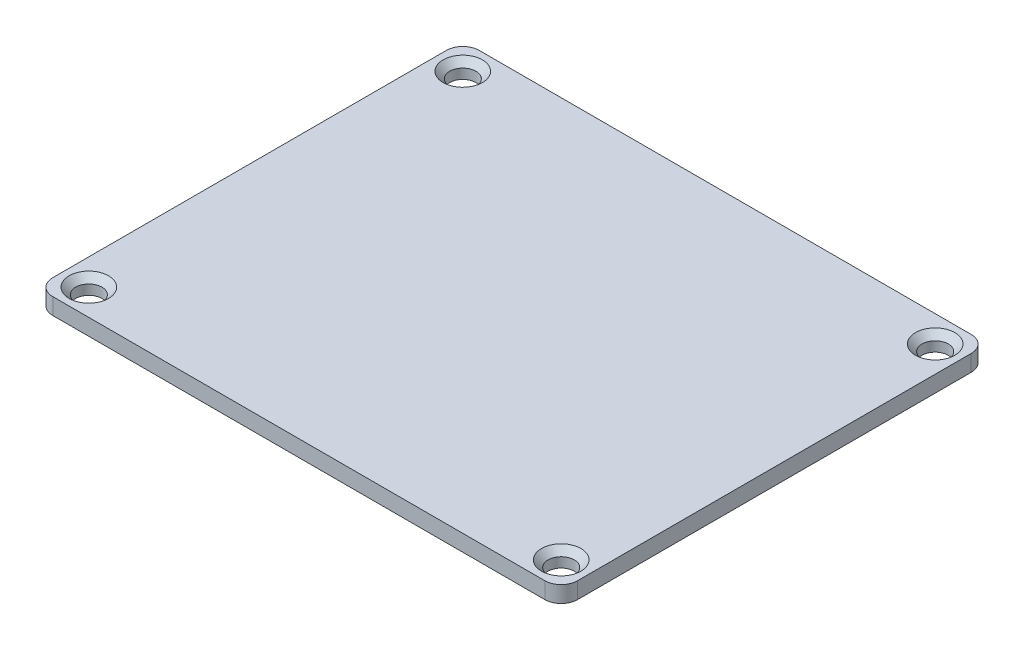
ISO-10303-21;
HEADER;
FILE_DESCRIPTION(('STEP AP214'),'2;1');
FILE_NAME('part.step','',(''),(''),'','','');
FILE_SCHEMA(('AUTOMOTIVE_DESIGN { 1 0 10303 214 1 1 1 1 }'));
ENDSEC;
DATA;
#1=APPLICATION_CONTEXT('core data for automotive mechanical design processes');
#2=APPLICATION_PROTOCOL_DEFINITION('international standard','automotive_design',2000,#1);
#3=PRODUCT_CONTEXT('',#1,'mechanical');
#4=PRODUCT('Part','Part','',(#3));
#5=PRODUCT_RELATED_PRODUCT_CATEGORY('part','',(#4));
#6=PRODUCT_DEFINITION_FORMATION('','',#4);
#7=PRODUCT_DEFINITION_CONTEXT('part definition',#1,'design');
#8=PRODUCT_DEFINITION('design','',#6,#7);
#9=PRODUCT_DEFINITION_SHAPE('','',#8);
#10=(LENGTH_UNIT() NAMED_UNIT(*) SI_UNIT(.MILLI.,.METRE.));
#11=(NAMED_UNIT(*) PLANE_ANGLE_UNIT() SI_UNIT($,.RADIAN.));
#12=(NAMED_UNIT(*) SI_UNIT($,.STERADIAN.) SOLID_ANGLE_UNIT());
#13=UNCERTAINTY_MEASURE_WITH_UNIT(LENGTH_MEASURE(1.E-05),#10,'distance_accuracy_value','');
#14=(GEOMETRIC_REPRESENTATION_CONTEXT(3) GLOBAL_UNCERTAINTY_ASSIGNED_CONTEXT((#13)) GLOBAL_UNIT_ASSIGNED_CONTEXT((#10,
#11,#12)) REPRESENTATION_CONTEXT('',''));
#15=CARTESIAN_POINT('',(0.,0.,0.));
#16=DIRECTION('',(0.,0.,1.));
#17=DIRECTION('',(1.,0.,0.));
#18=AXIS2_PLACEMENT_3D('',#15,#16,#17);
#19=CARTESIAN_POINT('',(-40.,2.5,32.5));
#20=DIRECTION('',(1.,0.,0.));
#21=DIRECTION('',(0.,0.,-1.));
#22=AXIS2_PLACEMENT_3D('',#19,#20,#21);
#23=PLANE('',#22);
#24=DIRECTION('',(0.,0.,1.));
#25=VECTOR('',#24,1.);
#26=CARTESIAN_POINT('',(-40.,2.5,32.5));
#27=LINE('',#26,#25);
#28=CARTESIAN_POINT('',(-40.,2.5,-30.));
#29=VERTEX_POINT('',#28);
#30=CARTESIAN_POINT('',(-40.,2.5,30.));
#31=VERTEX_POINT('',#30);
#32=EDGE_CURVE('E130',#29,#31,#27,.T.);
#33=ORIENTED_EDGE('',*,*,#32,.F.);
#34=DIRECTION('',(0.,-1.,0.));
#35=VECTOR('',#34,1.);
#36=CARTESIAN_POINT('',(-40.,2.5,-30.));
#37=LINE('',#36,#35);
#38=CARTESIAN_POINT('',(-40.,0.,-30.));
#39=VERTEX_POINT('',#38);
#40=EDGE_CURVE('E114',#29,#39,#37,.T.);
#41=ORIENTED_EDGE('',*,*,#40,.T.);
#42=DIRECTION('',(0.,0.,1.));
#43=VECTOR('',#42,1.);
#44=CARTESIAN_POINT('',(-40.,0.,32.5));
#45=LINE('',#44,#43);
#46=CARTESIAN_POINT('',(-40.,0.,30.));
#47=VERTEX_POINT('',#46);
#48=EDGE_CURVE('E127',#39,#47,#45,.T.);
#49=ORIENTED_EDGE('',*,*,#48,.T.);
#50=DIRECTION('',(0.,-1.,0.));
#51=VECTOR('',#50,1.);
#52=CARTESIAN_POINT('',(-40.,2.5,30.));
#53=LINE('',#52,#51);
#54=EDGE_CURVE('E133',#47,#31,#53,.F.);
#55=ORIENTED_EDGE('',*,*,#54,.T.);
#56=EDGE_LOOP('',(#33,#41,#49,#55));
#57=FACE_BOUND('',#56,.T.);
#58=ADVANCED_FACE('F41',(#57),#23,.F.);
#59=CARTESIAN_POINT('',(40.,2.5,32.5));
#60=DIRECTION('',(0.,0.,-1.));
#61=DIRECTION('',(-1.,0.,0.));
#62=AXIS2_PLACEMENT_3D('',#59,#60,#61);
#63=PLANE('',#62);
#64=DIRECTION('',(1.,0.,0.));
#65=VECTOR('',#64,1.);
#66=CARTESIAN_POINT('',(40.,0.,32.5));
#67=LINE('',#66,#65);
#68=CARTESIAN_POINT('',(-37.5,0.,32.5));
#69=VERTEX_POINT('',#68);
#70=CARTESIAN_POINT('',(37.5,0.,32.5));
#71=VERTEX_POINT('',#70);
#72=EDGE_CURVE('E138',#69,#71,#67,.T.);
#73=ORIENTED_EDGE('',*,*,#72,.T.);
#74=DIRECTION('',(0.,-1.,0.));
#75=VECTOR('',#74,1.);
#76=CARTESIAN_POINT('',(37.5,2.5,32.5));
#77=LINE('',#76,#75);
#78=CARTESIAN_POINT('',(37.5,2.5,32.5));
#79=VERTEX_POINT('',#78);
#80=EDGE_CURVE('E193',#71,#79,#77,.F.);
#81=ORIENTED_EDGE('',*,*,#80,.T.);
#82=DIRECTION('',(1.,0.,0.));
#83=VECTOR('',#82,1.);
#84=CARTESIAN_POINT('',(40.,2.5,32.5));
#85=LINE('',#84,#83);
#86=CARTESIAN_POINT('',(-37.5,2.5,32.5));
#87=VERTEX_POINT('',#86);
#88=EDGE_CURVE('E301',#87,#79,#85,.T.);
#89=ORIENTED_EDGE('',*,*,#88,.F.);
#90=DIRECTION('',(0.,-1.,0.));
#91=VECTOR('',#90,1.);
#92=CARTESIAN_POINT('',(-37.5,2.5,32.5));
#93=LINE('',#92,#91);
#94=EDGE_CURVE('E189',#87,#69,#93,.T.);
#95=ORIENTED_EDGE('',*,*,#94,.T.);
#96=EDGE_LOOP('',(#73,#81,#89,#95));
#97=FACE_BOUND('',#96,.T.);
#98=ADVANCED_FACE('F241',(#97),#63,.F.);
#99=CARTESIAN_POINT('',(40.,2.5,32.5));
#100=DIRECTION('',(-1.,0.,0.));
#101=DIRECTION('',(0.,0.,1.));
#102=AXIS2_PLACEMENT_3D('',#99,#100,#101);
#103=PLANE('',#102);
#104=DIRECTION('',(0.,0.,-1.));
#105=VECTOR('',#104,1.);
#106=CARTESIAN_POINT('',(40.,0.,32.5));
#107=LINE('',#106,#105);
#108=CARTESIAN_POINT('',(40.,0.,30.));
#109=VERTEX_POINT('',#108);
#110=CARTESIAN_POINT('',(40.,0.,-30.));
#111=VERTEX_POINT('',#110);
#112=EDGE_CURVE('E144',#109,#111,#107,.T.);
#113=ORIENTED_EDGE('',*,*,#112,.T.);
#114=DIRECTION('',(0.,-1.,0.));
#115=VECTOR('',#114,1.);
#116=CARTESIAN_POINT('',(40.,2.5,-30.));
#117=LINE('',#116,#115);
#118=CARTESIAN_POINT('',(40.,2.5,-30.));
#119=VERTEX_POINT('',#118);
#120=EDGE_CURVE('E58',#111,#119,#117,.F.);
#121=ORIENTED_EDGE('',*,*,#120,.T.);
#122=DIRECTION('',(0.,0.,-1.));
#123=VECTOR('',#122,1.);
#124=CARTESIAN_POINT('',(40.,2.5,32.5));
#125=LINE('',#124,#123);
#126=CARTESIAN_POINT('',(40.,2.5,30.));
#127=VERTEX_POINT('',#126);
#128=EDGE_CURVE('E303',#127,#119,#125,.T.);
#129=ORIENTED_EDGE('',*,*,#128,.F.);
#130=DIRECTION('',(0.,-1.,0.));
#131=VECTOR('',#130,1.);
#132=CARTESIAN_POINT('',(40.,2.5,30.));
#133=LINE('',#132,#131);
#134=EDGE_CURVE('E183',#127,#109,#133,.T.);
#135=ORIENTED_EDGE('',*,*,#134,.T.);
#136=EDGE_LOOP('',(#113,#121,#129,#135));
#137=FACE_BOUND('',#136,.T.);
#138=ADVANCED_FACE('F246',(#137),#103,.F.);
#139=CARTESIAN_POINT('',(40.,2.5,-32.5));
#140=DIRECTION('',(0.,0.,1.));
#141=DIRECTION('',(1.,0.,0.));
#142=AXIS2_PLACEMENT_3D('',#139,#140,#141);
#143=PLANE('',#142);
#144=DIRECTION('',(-1.,0.,0.));
#145=VECTOR('',#144,1.);
#146=CARTESIAN_POINT('',(40.,0.,-32.5));
#147=LINE('',#146,#145);
#148=CARTESIAN_POINT('',(37.5,0.,-32.5));
#149=VERTEX_POINT('',#148);
#150=CARTESIAN_POINT('',(-37.5,0.,-32.5));
#151=VERTEX_POINT('',#150);
#152=EDGE_CURVE('E155',#149,#151,#147,.T.);
#153=ORIENTED_EDGE('',*,*,#152,.T.);
#154=DIRECTION('',(0.,-1.,0.));
#155=VECTOR('',#154,1.);
#156=CARTESIAN_POINT('',(-37.5,2.5,-32.5));
#157=LINE('',#156,#155);
#158=CARTESIAN_POINT('',(-37.5,2.5,-32.5));
#159=VERTEX_POINT('',#158);
#160=EDGE_CURVE('E115',#151,#159,#157,.F.);
#161=ORIENTED_EDGE('',*,*,#160,.T.);
#162=DIRECTION('',(-1.,0.,0.));
#163=VECTOR('',#162,1.);
#164=CARTESIAN_POINT('',(40.,2.5,-32.5));
#165=LINE('',#164,#163);
#166=CARTESIAN_POINT('',(37.5,2.5,-32.5));
#167=VERTEX_POINT('',#166);
#168=EDGE_CURVE('E150',#167,#159,#165,.T.);
#169=ORIENTED_EDGE('',*,*,#168,.F.);
#170=DIRECTION('',(0.,-1.,0.));
#171=VECTOR('',#170,1.);
#172=CARTESIAN_POINT('',(37.5,2.5,-32.5));
#173=LINE('',#172,#171);
#174=EDGE_CURVE('E121',#167,#149,#173,.T.);
#175=ORIENTED_EDGE('',*,*,#174,.T.);
#176=EDGE_LOOP('',(#153,#161,#169,#175));
#177=FACE_BOUND('',#176,.T.);
#178=ADVANCED_FACE('F312',(#177),#143,.F.);
#179=CARTESIAN_POINT('',(0.,2.5,0.));
#180=DIRECTION('',(0.,1.,0.));
#181=DIRECTION('',(0.,0.,1.));
#182=AXIS2_PLACEMENT_3D('',#179,#180,#181);
#183=PLANE('',#182);
#184=CARTESIAN_POINT('',(36.,2.5,-28.5));
#185=DIRECTION('',(0.,1.,0.));
#186=DIRECTION('',(0.,0.,1.));
#187=AXIS2_PLACEMENT_3D('',#184,#185,#186);
#188=CIRCLE('',#187,3.);
#189=CARTESIAN_POINT('',(36.,2.5,-25.5));
#190=VERTEX_POINT('',#189);
#191=EDGE_CURVE('E212',#190,#190,#188,.F.);
#192=ORIENTED_EDGE('',*,*,#191,.T.);
#193=EDGE_LOOP('',(#192));
#194=FACE_BOUND('',#193,.T.);
#195=CARTESIAN_POINT('',(36.,2.5,28.5));
#196=DIRECTION('',(0.,1.,0.));
#197=DIRECTION('',(0.,0.,1.));
#198=AXIS2_PLACEMENT_3D('',#195,#196,#197);
#199=CIRCLE('',#198,3.);
#200=CARTESIAN_POINT('',(36.,2.5,31.5));
#201=VERTEX_POINT('',#200);
#202=EDGE_CURVE('E208',#201,#201,#199,.F.);
#203=ORIENTED_EDGE('',*,*,#202,.T.);
#204=EDGE_LOOP('',(#203));
#205=FACE_BOUND('',#204,.T.);
#206=CARTESIAN_POINT('',(-36.,2.5,28.5));
#207=DIRECTION('',(0.,1.,0.));
#208=DIRECTION('',(0.,0.,1.));
#209=AXIS2_PLACEMENT_3D('',#206,#207,#208);
#210=CIRCLE('',#209,3.);
#211=CARTESIAN_POINT('',(-36.,2.5,31.5));
#212=VERTEX_POINT('',#211);
#213=EDGE_CURVE('E204',#212,#212,#210,.F.);
#214=ORIENTED_EDGE('',*,*,#213,.T.);
#215=EDGE_LOOP('',(#214));
#216=FACE_BOUND('',#215,.T.);
#217=CARTESIAN_POINT('',(-36.,2.5,-28.5));
#218=DIRECTION('',(0.,1.,0.));
#219=DIRECTION('',(0.,0.,1.));
#220=AXIS2_PLACEMENT_3D('',#217,#218,#219);
#221=CIRCLE('',#220,3.);
#222=CARTESIAN_POINT('',(-36.,2.5,-25.5));
#223=VERTEX_POINT('',#222);
#224=EDGE_CURVE('E200',#223,#223,#221,.F.);
#225=ORIENTED_EDGE('',*,*,#224,.T.);
#226=EDGE_LOOP('',(#225));
#227=FACE_BOUND('',#226,.T.);
#228=ORIENTED_EDGE('',*,*,#168,.T.);
#229=CARTESIAN_POINT('',(-37.5,2.5,-30.));
#230=DIRECTION('',(0.,1.,0.));
#231=DIRECTION('',(0.,0.,1.));
#232=AXIS2_PLACEMENT_3D('',#229,#230,#231);
#233=CIRCLE('',#232,2.5);
#234=EDGE_CURVE('E180',#159,#29,#233,.T.);
#235=ORIENTED_EDGE('',*,*,#234,.T.);
#236=ORIENTED_EDGE('',*,*,#32,.T.);
#237=CARTESIAN_POINT('',(-37.5,2.5,30.));
#238=DIRECTION('',(0.,1.,0.));
#239=DIRECTION('',(0.,0.,1.));
#240=AXIS2_PLACEMENT_3D('',#237,#238,#239);
#241=CIRCLE('',#240,2.5);
#242=EDGE_CURVE('E172',#31,#87,#241,.T.);
#243=ORIENTED_EDGE('',*,*,#242,.T.);
#244=ORIENTED_EDGE('',*,*,#88,.T.);
#245=CARTESIAN_POINT('',(37.5,2.5,30.));
#246=DIRECTION('',(0.,1.,0.));
#247=DIRECTION('',(0.,0.,1.));
#248=AXIS2_PLACEMENT_3D('',#245,#246,#247);
#249=CIRCLE('',#248,2.5);
#250=EDGE_CURVE('E65',#79,#127,#249,.T.);
#251=ORIENTED_EDGE('',*,*,#250,.T.);
#252=ORIENTED_EDGE('',*,*,#128,.T.);
#253=CARTESIAN_POINT('',(37.5,2.5,-30.));
#254=DIRECTION('',(0.,1.,0.));
#255=DIRECTION('',(0.,0.,1.));
#256=AXIS2_PLACEMENT_3D('',#253,#254,#255);
#257=CIRCLE('',#256,2.5);
#258=EDGE_CURVE('E177',#119,#167,#257,.T.);
#259=ORIENTED_EDGE('',*,*,#258,.T.);
#260=EDGE_LOOP('',(#228,#235,#236,#243,#244,#251,#252,#259));
#261=FACE_BOUND('',#260,.T.);
#262=ADVANCED_FACE('F309',(#194,#205,#216,#227,#261),#183,.T.);
#263=CARTESIAN_POINT('',(0.,0.,0.));
#264=DIRECTION('',(0.,1.,0.));
#265=DIRECTION('',(0.,0.,1.));
#266=AXIS2_PLACEMENT_3D('',#263,#264,#265);
#267=PLANE('',#266);
#268=CARTESIAN_POINT('',(36.,0.,-28.5));
#269=DIRECTION('',(0.,1.,0.));
#270=DIRECTION('',(0.,0.,1.));
#271=AXIS2_PLACEMENT_3D('',#268,#269,#270);
#272=CIRCLE('',#271,1.99999999999999);
#273=CARTESIAN_POINT('',(36.,0.,-26.5));
#274=VERTEX_POINT('',#273);
#275=EDGE_CURVE('E147',#274,#274,#272,.F.);
#276=ORIENTED_EDGE('',*,*,#275,.F.);
#277=EDGE_LOOP('',(#276));
#278=FACE_BOUND('',#277,.T.);
#279=CARTESIAN_POINT('',(-36.,0.,28.5));
#280=DIRECTION('',(0.,1.,0.));
#281=DIRECTION('',(0.,0.,1.));
#282=AXIS2_PLACEMENT_3D('',#279,#280,#281);
#283=CIRCLE('',#282,1.99999999999999);
#284=CARTESIAN_POINT('',(-36.,0.,30.5));
#285=VERTEX_POINT('',#284);
#286=EDGE_CURVE('E291',#285,#285,#283,.F.);
#287=ORIENTED_EDGE('',*,*,#286,.F.);
#288=EDGE_LOOP('',(#287));
#289=FACE_BOUND('',#288,.T.);
#290=CARTESIAN_POINT('',(36.,0.,28.5));
#291=DIRECTION('',(0.,1.,0.));
#292=DIRECTION('',(0.,0.,1.));
#293=AXIS2_PLACEMENT_3D('',#290,#291,#292);
#294=CIRCLE('',#293,1.99999999999999);
#295=CARTESIAN_POINT('',(36.,0.,30.5));
#296=VERTEX_POINT('',#295);
#297=EDGE_CURVE('E295',#296,#296,#294,.F.);
#298=ORIENTED_EDGE('',*,*,#297,.F.);
#299=EDGE_LOOP('',(#298));
#300=FACE_BOUND('',#299,.T.);
#301=CARTESIAN_POINT('',(-36.,0.,-28.5));
#302=DIRECTION('',(0.,1.,0.));
#303=DIRECTION('',(0.,0.,1.));
#304=AXIS2_PLACEMENT_3D('',#301,#302,#303);
#305=CIRCLE('',#304,1.99999999999999);
#306=CARTESIAN_POINT('',(-36.,0.,-26.5));
#307=VERTEX_POINT('',#306);
#308=EDGE_CURVE('E139',#307,#307,#305,.F.);
#309=ORIENTED_EDGE('',*,*,#308,.F.);
#310=EDGE_LOOP('',(#309));
#311=FACE_BOUND('',#310,.T.);
#312=ORIENTED_EDGE('',*,*,#48,.F.);
#313=CARTESIAN_POINT('',(-37.5,0.,-30.));
#314=DIRECTION('',(0.,1.,0.));
#315=DIRECTION('',(0.,0.,1.));
#316=AXIS2_PLACEMENT_3D('',#313,#314,#315);
#317=CIRCLE('',#316,2.5);
#318=EDGE_CURVE('E110',#39,#151,#317,.F.);
#319=ORIENTED_EDGE('',*,*,#318,.T.);
#320=ORIENTED_EDGE('',*,*,#152,.F.);
#321=CARTESIAN_POINT('',(37.5,0.,-30.));
#322=DIRECTION('',(0.,1.,0.));
#323=DIRECTION('',(0.,0.,1.));
#324=AXIS2_PLACEMENT_3D('',#321,#322,#323);
#325=CIRCLE('',#324,2.5);
#326=EDGE_CURVE('E122',#149,#111,#325,.F.);
#327=ORIENTED_EDGE('',*,*,#326,.T.);
#328=ORIENTED_EDGE('',*,*,#112,.F.);
#329=CARTESIAN_POINT('',(37.5,0.,30.));
#330=DIRECTION('',(0.,1.,0.));
#331=DIRECTION('',(0.,0.,1.));
#332=AXIS2_PLACEMENT_3D('',#329,#330,#331);
#333=CIRCLE('',#332,2.5);
#334=EDGE_CURVE('E162',#109,#71,#333,.F.);
#335=ORIENTED_EDGE('',*,*,#334,.T.);
#336=ORIENTED_EDGE('',*,*,#72,.F.);
#337=CARTESIAN_POINT('',(-37.5,0.,30.));
#338=DIRECTION('',(0.,1.,0.));
#339=DIRECTION('',(0.,0.,1.));
#340=AXIS2_PLACEMENT_3D('',#337,#338,#339);
#341=CIRCLE('',#340,2.5);
#342=EDGE_CURVE('E132',#69,#47,#341,.F.);
#343=ORIENTED_EDGE('',*,*,#342,.T.);
#344=EDGE_LOOP('',(#312,#319,#320,#327,#328,#335,#336,#343));
#345=FACE_BOUND('',#344,.T.);
#346=ADVANCED_FACE('F135',(#278,#289,#300,#311,#345),#267,.F.);
#347=CARTESIAN_POINT('',(-36.,-0.00100000000000013,-28.5));
#348=DIRECTION('',(0.,1.,0.));
#349=DIRECTION('',(0.,0.,1.));
#350=AXIS2_PLACEMENT_3D('',#347,#348,#349);
#351=CYLINDRICAL_SURFACE('',#350,1.99999999999999);
#352=CARTESIAN_POINT('',(-36.,1.49999999999999,-28.5));
#353=DIRECTION('',(0.,1.,0.));
#354=DIRECTION('',(0.,0.,1.));
#355=AXIS2_PLACEMENT_3D('',#352,#353,#354);
#356=CIRCLE('',#355,1.99999999999999);
#357=CARTESIAN_POINT('',(-36.,1.49999999999999,-26.5));
#358=VERTEX_POINT('',#357);
#359=EDGE_CURVE('E11',#358,#358,#356,.T.);
#360=ORIENTED_EDGE('',*,*,#359,.T.);
#361=EDGE_LOOP('',(#360));
#362=FACE_BOUND('',#361,.T.);
#363=ORIENTED_EDGE('',*,*,#308,.T.);
#364=EDGE_LOOP('',(#363));
#365=FACE_BOUND('',#364,.T.);
#366=ADVANCED_FACE('F327',(#362,#365),#351,.F.);
#367=CARTESIAN_POINT('',(36.,-0.00100000000000013,28.5));
#368=DIRECTION('',(0.,1.,0.));
#369=DIRECTION('',(0.,0.,1.));
#370=AXIS2_PLACEMENT_3D('',#367,#368,#369);
#371=CYLINDRICAL_SURFACE('',#370,1.99999999999999);
#372=CARTESIAN_POINT('',(36.,1.49999999999999,28.5));
#373=DIRECTION('',(0.,1.,0.));
#374=DIRECTION('',(0.,0.,1.));
#375=AXIS2_PLACEMENT_3D('',#372,#373,#374);
#376=CIRCLE('',#375,1.99999999999999);
#377=CARTESIAN_POINT('',(36.,1.49999999999999,30.5));
#378=VERTEX_POINT('',#377);
#379=EDGE_CURVE('E216',#378,#378,#376,.T.);
#380=ORIENTED_EDGE('',*,*,#379,.T.);
#381=EDGE_LOOP('',(#380));
#382=FACE_BOUND('',#381,.T.);
#383=ORIENTED_EDGE('',*,*,#297,.T.);
#384=EDGE_LOOP('',(#383));
#385=FACE_BOUND('',#384,.T.);
#386=ADVANCED_FACE('F333',(#382,#385),#371,.F.);
#387=CARTESIAN_POINT('',(-36.,-0.00100000000000013,28.5));
#388=DIRECTION('',(0.,1.,0.));
#389=DIRECTION('',(0.,0.,1.));
#390=AXIS2_PLACEMENT_3D('',#387,#388,#389);
#391=CYLINDRICAL_SURFACE('',#390,1.99999999999999);
#392=CARTESIAN_POINT('',(-36.,1.49999999999999,28.5));
#393=DIRECTION('',(0.,1.,0.));
#394=DIRECTION('',(0.,0.,1.));
#395=AXIS2_PLACEMENT_3D('',#392,#393,#394);
#396=CIRCLE('',#395,1.99999999999999);
#397=CARTESIAN_POINT('',(-36.,1.49999999999999,30.5));
#398=VERTEX_POINT('',#397);
#399=EDGE_CURVE('E51',#398,#398,#396,.T.);
#400=ORIENTED_EDGE('',*,*,#399,.T.);
#401=EDGE_LOOP('',(#400));
#402=FACE_BOUND('',#401,.T.);
#403=ORIENTED_EDGE('',*,*,#286,.T.);
#404=EDGE_LOOP('',(#403));
#405=FACE_BOUND('',#404,.T.);
#406=ADVANCED_FACE('F223',(#402,#405),#391,.F.);
#407=CARTESIAN_POINT('',(36.,-0.00100000000000013,-28.5));
#408=DIRECTION('',(0.,1.,0.));
#409=DIRECTION('',(0.,0.,1.));
#410=AXIS2_PLACEMENT_3D('',#407,#408,#409);
#411=CYLINDRICAL_SURFACE('',#410,1.99999999999999);
#412=CARTESIAN_POINT('',(36.,1.49999999999999,-28.5));
#413=DIRECTION('',(0.,1.,0.));
#414=DIRECTION('',(0.,0.,1.));
#415=AXIS2_PLACEMENT_3D('',#412,#413,#414);
#416=CIRCLE('',#415,1.99999999999999);
#417=CARTESIAN_POINT('',(36.,1.49999999999999,-26.5));
#418=VERTEX_POINT('',#417);
#419=EDGE_CURVE('E196',#418,#418,#416,.T.);
#420=ORIENTED_EDGE('',*,*,#419,.T.);
#421=EDGE_LOOP('',(#420));
#422=FACE_BOUND('',#421,.T.);
#423=ORIENTED_EDGE('',*,*,#275,.T.);
#424=EDGE_LOOP('',(#423));
#425=FACE_BOUND('',#424,.T.);
#426=ADVANCED_FACE('F254',(#422,#425),#411,.F.);
#427=CARTESIAN_POINT('',(-37.5,2.5,-30.));
#428=DIRECTION('',(0.,-1.,0.));
#429=DIRECTION('',(0.,0.,-1.));
#430=AXIS2_PLACEMENT_3D('',#427,#428,#429);
#431=CYLINDRICAL_SURFACE('',#430,2.5);
#432=ORIENTED_EDGE('',*,*,#234,.F.);
#433=ORIENTED_EDGE('',*,*,#160,.F.);
#434=ORIENTED_EDGE('',*,*,#318,.F.);
#435=ORIENTED_EDGE('',*,*,#40,.F.);
#436=EDGE_LOOP('',(#432,#433,#434,#435));
#437=FACE_BOUND('',#436,.T.);
#438=ADVANCED_FACE('F113',(#437),#431,.T.);
#439=CARTESIAN_POINT('',(37.5,2.5,-30.));
#440=DIRECTION('',(0.,-1.,0.));
#441=DIRECTION('',(0.,0.,-1.));
#442=AXIS2_PLACEMENT_3D('',#439,#440,#441);
#443=CYLINDRICAL_SURFACE('',#442,2.5);
#444=ORIENTED_EDGE('',*,*,#258,.F.);
#445=ORIENTED_EDGE('',*,*,#120,.F.);
#446=ORIENTED_EDGE('',*,*,#326,.F.);
#447=ORIENTED_EDGE('',*,*,#174,.F.);
#448=EDGE_LOOP('',(#444,#445,#446,#447));
#449=FACE_BOUND('',#448,.T.);
#450=ADVANCED_FACE('F253',(#449),#443,.T.);
#451=CARTESIAN_POINT('',(37.5,2.5,30.));
#452=DIRECTION('',(0.,-1.,0.));
#453=DIRECTION('',(0.,0.,-1.));
#454=AXIS2_PLACEMENT_3D('',#451,#452,#453);
#455=CYLINDRICAL_SURFACE('',#454,2.5);
#456=ORIENTED_EDGE('',*,*,#250,.F.);
#457=ORIENTED_EDGE('',*,*,#80,.F.);
#458=ORIENTED_EDGE('',*,*,#334,.F.);
#459=ORIENTED_EDGE('',*,*,#134,.F.);
#460=EDGE_LOOP('',(#456,#457,#458,#459));
#461=FACE_BOUND('',#460,.T.);
#462=ADVANCED_FACE('F257',(#461),#455,.T.);
#463=CARTESIAN_POINT('',(-37.5,2.5,30.));
#464=DIRECTION('',(0.,-1.,0.));
#465=DIRECTION('',(0.,0.,-1.));
#466=AXIS2_PLACEMENT_3D('',#463,#464,#465);
#467=CYLINDRICAL_SURFACE('',#466,2.5);
#468=ORIENTED_EDGE('',*,*,#242,.F.);
#469=ORIENTED_EDGE('',*,*,#54,.F.);
#470=ORIENTED_EDGE('',*,*,#342,.F.);
#471=ORIENTED_EDGE('',*,*,#94,.F.);
#472=EDGE_LOOP('',(#468,#469,#470,#471));
#473=FACE_BOUND('',#472,.T.);
#474=ADVANCED_FACE('F261',(#473),#467,.T.);
#475=CARTESIAN_POINT('',(36.,1.49999999999999,-28.5));
#476=DIRECTION('',(0.,1.,0.));
#477=DIRECTION('',(0.,0.,1.));
#478=AXIS2_PLACEMENT_3D('',#475,#476,#477);
#479=CONICAL_SURFACE('',#478,1.99999999999999,0.785398163397452);
#480=ORIENTED_EDGE('',*,*,#191,.F.);
#481=EDGE_LOOP('',(#480));
#482=FACE_BOUND('',#481,.T.);
#483=ORIENTED_EDGE('',*,*,#419,.F.);
#484=EDGE_LOOP('',(#483));
#485=FACE_BOUND('',#484,.T.);
#486=ADVANCED_FACE('F235',(#482,#485),#479,.F.);
#487=CARTESIAN_POINT('',(36.,1.49999999999999,28.5));
#488=DIRECTION('',(0.,1.,0.));
#489=DIRECTION('',(0.,0.,1.));
#490=AXIS2_PLACEMENT_3D('',#487,#488,#489);
#491=CONICAL_SURFACE('',#490,1.99999999999999,0.785398163397452);
#492=ORIENTED_EDGE('',*,*,#202,.F.);
#493=EDGE_LOOP('',(#492));
#494=FACE_BOUND('',#493,.T.);
#495=ORIENTED_EDGE('',*,*,#379,.F.);
#496=EDGE_LOOP('',(#495));
#497=FACE_BOUND('',#496,.T.);
#498=ADVANCED_FACE('F228',(#494,#497),#491,.F.);
#499=CARTESIAN_POINT('',(-36.,1.49999999999999,28.5));
#500=DIRECTION('',(0.,1.,0.));
#501=DIRECTION('',(0.,0.,1.));
#502=AXIS2_PLACEMENT_3D('',#499,#500,#501);
#503=CONICAL_SURFACE('',#502,1.99999999999999,0.785398163397452);
#504=ORIENTED_EDGE('',*,*,#213,.F.);
#505=EDGE_LOOP('',(#504));
#506=FACE_BOUND('',#505,.T.);
#507=ORIENTED_EDGE('',*,*,#399,.F.);
#508=EDGE_LOOP('',(#507));
#509=FACE_BOUND('',#508,.T.);
#510=ADVANCED_FACE('F226',(#506,#509),#503,.F.);
#511=CARTESIAN_POINT('',(-36.,1.49999999999999,-28.5));
#512=DIRECTION('',(0.,1.,0.));
#513=DIRECTION('',(0.,0.,1.));
#514=AXIS2_PLACEMENT_3D('',#511,#512,#513);
#515=CONICAL_SURFACE('',#514,1.99999999999999,0.785398163397452);
#516=ORIENTED_EDGE('',*,*,#224,.F.);
#517=EDGE_LOOP('',(#516));
#518=FACE_BOUND('',#517,.T.);
#519=ORIENTED_EDGE('',*,*,#359,.F.);
#520=EDGE_LOOP('',(#519));
#521=FACE_BOUND('',#520,.T.);
#522=ADVANCED_FACE('F44',(#518,#521),#515,.F.);
#523=CLOSED_SHELL('',(#58,#98,#138,#178,#262,#346,#366,#386,#406,#426,#438,#450,#462,#474,#486,
#498,#510,#522));
#524=MANIFOLD_SOLID_BREP('B2',#523);
#525=ADVANCED_BREP_SHAPE_REPRESENTATION('',(#18,#524),#14);
#526=SHAPE_DEFINITION_REPRESENTATION(#9,#525);
ENDSEC;
END-ISO-10303-21;
